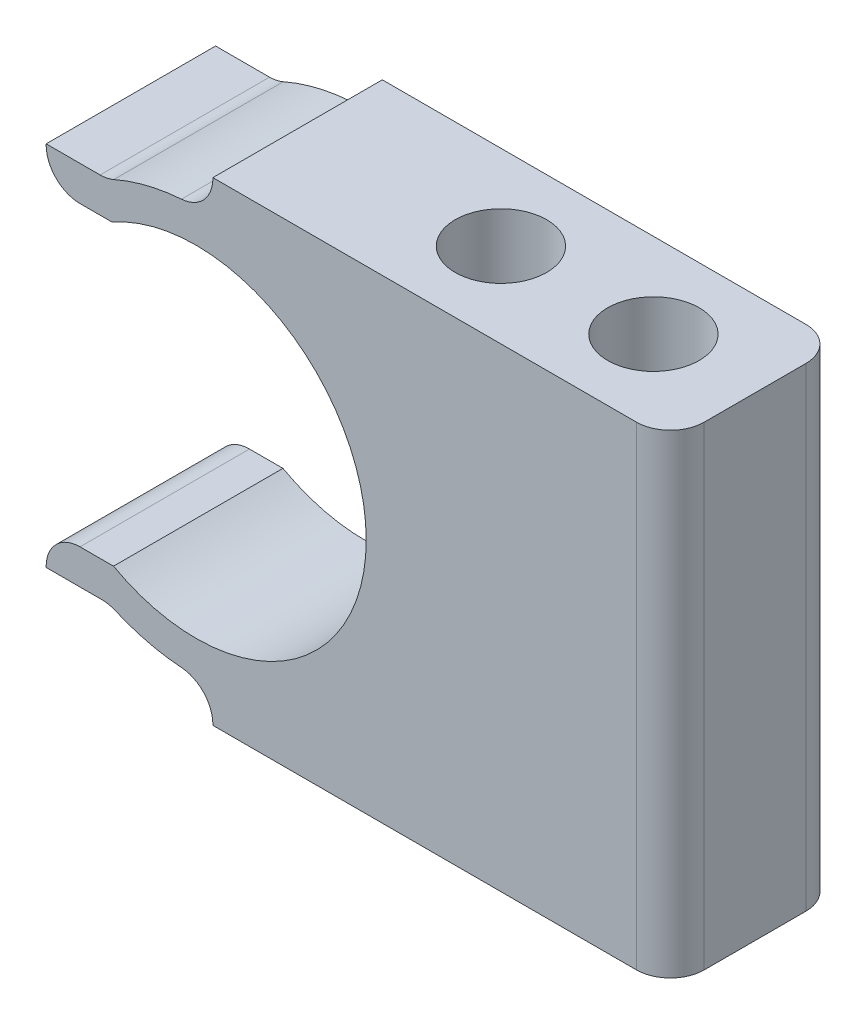
ISO-10303-21;
HEADER;
FILE_DESCRIPTION(('STEP AP214'),'2;1');
FILE_NAME('part.step','',(''),(''),'','','');
FILE_SCHEMA(('AUTOMOTIVE_DESIGN { 1 0 10303 214 1 1 1 1 }'));
ENDSEC;
DATA;
#1=APPLICATION_CONTEXT('core data for automotive mechanical design processes');
#2=APPLICATION_PROTOCOL_DEFINITION('international standard','automotive_design',2000,#1);
#3=PRODUCT_CONTEXT('',#1,'mechanical');
#4=PRODUCT('Part','Part','',(#3));
#5=PRODUCT_RELATED_PRODUCT_CATEGORY('part','',(#4));
#6=PRODUCT_DEFINITION_FORMATION('','',#4);
#7=PRODUCT_DEFINITION_CONTEXT('part definition',#1,'design');
#8=PRODUCT_DEFINITION('design','',#6,#7);
#9=PRODUCT_DEFINITION_SHAPE('','',#8);
#10=(LENGTH_UNIT() NAMED_UNIT(*) SI_UNIT(.MILLI.,.METRE.));
#11=(NAMED_UNIT(*) PLANE_ANGLE_UNIT() SI_UNIT($,.RADIAN.));
#12=(NAMED_UNIT(*) SI_UNIT($,.STERADIAN.) SOLID_ANGLE_UNIT());
#13=UNCERTAINTY_MEASURE_WITH_UNIT(LENGTH_MEASURE(1.E-05),#10,'distance_accuracy_value','');
#14=(GEOMETRIC_REPRESENTATION_CONTEXT(3) GLOBAL_UNCERTAINTY_ASSIGNED_CONTEXT((#13)) GLOBAL_UNIT_ASSIGNED_CONTEXT((#10,
#11,#12)) REPRESENTATION_CONTEXT('',''));
#15=CARTESIAN_POINT('',(0.,0.,0.));
#16=DIRECTION('',(0.,0.,1.));
#17=DIRECTION('',(1.,0.,0.));
#18=AXIS2_PLACEMENT_3D('',#15,#16,#17);
#19=CARTESIAN_POINT('',(0.,0.,10.));
#20=DIRECTION('',(0.,0.,-1.));
#21=DIRECTION('',(-1.,0.,0.));
#22=AXIS2_PLACEMENT_3D('',#19,#20,#21);
#23=CYLINDRICAL_SURFACE('',#22,10.05);
#24=CARTESIAN_POINT('',(0.,0.,0.));
#25=DIRECTION('',(0.,0.,-1.));
#26=DIRECTION('',(1.,0.,0.));
#27=AXIS2_PLACEMENT_3D('',#24,#25,#26);
#28=CIRCLE('',#27,10.05);
#29=CARTESIAN_POINT('',(-4.94368283772331,8.75,0.));
#30=VERTEX_POINT('',#29);
#31=CARTESIAN_POINT('',(-4.86543532867307,-8.79375,0.));
#32=VERTEX_POINT('',#31);
#33=EDGE_CURVE('E208',#30,#32,#28,.T.);
#34=ORIENTED_EDGE('',*,*,#33,.T.);
#35=DIRECTION('',(0.,0.,-1.));
#36=VECTOR('',#35,1.);
#37=CARTESIAN_POINT('',(-4.86543532867307,-8.79375,10.));
#38=LINE('',#37,#36);
#39=CARTESIAN_POINT('',(-4.86543532867307,-8.79375,10.));
#40=VERTEX_POINT('',#39);
#41=EDGE_CURVE('E188',#40,#32,#38,.T.);
#42=ORIENTED_EDGE('',*,*,#41,.F.);
#43=CARTESIAN_POINT('',(0.,0.,10.));
#44=DIRECTION('',(0.,0.,-1.));
#45=DIRECTION('',(1.,0.,0.));
#46=AXIS2_PLACEMENT_3D('',#43,#44,#45);
#47=CIRCLE('',#46,10.05);
#48=CARTESIAN_POINT('',(-4.94368283772331,8.75,10.));
#49=VERTEX_POINT('',#48);
#50=EDGE_CURVE('E195',#49,#40,#47,.T.);
#51=ORIENTED_EDGE('',*,*,#50,.F.);
#52=DIRECTION('',(0.,0.,-1.));
#53=VECTOR('',#52,1.);
#54=CARTESIAN_POINT('',(-4.94368283772331,8.75,10.));
#55=LINE('',#54,#53);
#56=EDGE_CURVE('E318',#49,#30,#55,.T.);
#57=ORIENTED_EDGE('',*,*,#56,.T.);
#58=EDGE_LOOP('',(#34,#42,#51,#57));
#59=FACE_BOUND('',#58,.T.);
#60=ADVANCED_FACE('F33',(#59),#23,.F.);
#61=CARTESIAN_POINT('',(-8.84122918275927,-8.79375,10.));
#62=DIRECTION('',(0.,-1.,0.));
#63=DIRECTION('',(0.,0.,-1.));
#64=AXIS2_PLACEMENT_3D('',#61,#62,#63);
#65=PLANE('',#64);
#66=DIRECTION('',(-1.,0.,0.));
#67=VECTOR('',#66,1.);
#68=CARTESIAN_POINT('',(-8.84122918275927,-8.79375,0.));
#69=LINE('',#68,#67);
#70=CARTESIAN_POINT('',(-6.84122918275927,-8.79375,0.));
#71=VERTEX_POINT('',#70);
#72=EDGE_CURVE('E320',#32,#71,#69,.T.);
#73=ORIENTED_EDGE('',*,*,#72,.T.);
#74=DIRECTION('',(0.,0.,-1.));
#75=VECTOR('',#74,1.);
#76=CARTESIAN_POINT('',(-6.84122918275927,-8.79375,10.));
#77=LINE('',#76,#75);
#78=CARTESIAN_POINT('',(-6.84122918275927,-8.79375,10.));
#79=VERTEX_POINT('',#78);
#80=EDGE_CURVE('E191',#71,#79,#77,.F.);
#81=ORIENTED_EDGE('',*,*,#80,.T.);
#82=DIRECTION('',(-1.,0.,0.));
#83=VECTOR('',#82,1.);
#84=CARTESIAN_POINT('',(-8.84122918275927,-8.79375,10.));
#85=LINE('',#84,#83);
#86=EDGE_CURVE('E183',#40,#79,#85,.T.);
#87=ORIENTED_EDGE('',*,*,#86,.F.);
#88=ORIENTED_EDGE('',*,*,#41,.T.);
#89=EDGE_LOOP('',(#73,#81,#87,#88));
#90=FACE_BOUND('',#89,.T.);
#91=ADVANCED_FACE('F186',(#90),#65,.F.);
#92=CARTESIAN_POINT('',(-8.84122918275927,-8.79375,10.));
#93=DIRECTION('',(1.,0.,0.));
#94=DIRECTION('',(0.,0.,-1.));
#95=AXIS2_PLACEMENT_3D('',#92,#93,#94);
#96=PLANE('',#95);
#97=DIRECTION('',(0.,-1.,0.));
#98=VECTOR('',#97,1.);
#99=CARTESIAN_POINT('',(-8.84122918275927,-8.79375,10.));
#100=LINE('',#99,#98);
#101=CARTESIAN_POINT('',(-8.84122918275927,-10.79375,10.));
#102=VERTEX_POINT('',#101);
#103=CARTESIAN_POINT('',(-8.84122918275927,-10.8492411194625,10.));
#104=VERTEX_POINT('',#103);
#105=EDGE_CURVE('E194',#102,#104,#100,.T.);
#106=ORIENTED_EDGE('',*,*,#105,.F.);
#107=DIRECTION('',(0.,0.,-1.));
#108=VECTOR('',#107,1.);
#109=CARTESIAN_POINT('',(-8.84122918275927,-10.79375,10.));
#110=LINE('',#109,#108);
#111=CARTESIAN_POINT('',(-8.84122918275927,-10.79375,0.));
#112=VERTEX_POINT('',#111);
#113=EDGE_CURVE('E251',#102,#112,#110,.T.);
#114=ORIENTED_EDGE('',*,*,#113,.T.);
#115=DIRECTION('',(0.,-1.,0.));
#116=VECTOR('',#115,1.);
#117=CARTESIAN_POINT('',(-8.84122918275927,-8.79375,0.));
#118=LINE('',#117,#116);
#119=CARTESIAN_POINT('',(-8.84122918275927,-10.8492411194625,0.));
#120=VERTEX_POINT('',#119);
#121=EDGE_CURVE('E323',#112,#120,#118,.T.);
#122=ORIENTED_EDGE('',*,*,#121,.T.);
#123=DIRECTION('',(0.,0.,-1.));
#124=VECTOR('',#123,1.);
#125=CARTESIAN_POINT('',(-8.84122918275927,-10.8492411194625,10.));
#126=LINE('',#125,#124);
#127=EDGE_CURVE('E210',#104,#120,#126,.T.);
#128=ORIENTED_EDGE('',*,*,#127,.F.);
#129=EDGE_LOOP('',(#106,#114,#122,#128));
#130=FACE_BOUND('',#129,.T.);
#131=ADVANCED_FACE('F408',(#130),#96,.F.);
#132=CARTESIAN_POINT('',(-5.12776434050588,-10.8492411194625,10.));
#133=DIRECTION('',(0.,1.,0.));
#134=DIRECTION('',(-1.,0.,0.));
#135=AXIS2_PLACEMENT_3D('',#132,#133,#134);
#136=PLANE('',#135);
#137=DIRECTION('',(1.,0.,0.));
#138=VECTOR('',#137,1.);
#139=CARTESIAN_POINT('',(-5.12776434050588,-10.8492411194625,0.));
#140=LINE('',#139,#138);
#141=CARTESIAN_POINT('',(-5.55850723251429,-10.8492411194625,0.));
#142=VERTEX_POINT('',#141);
#143=EDGE_CURVE('E325',#120,#142,#140,.T.);
#144=ORIENTED_EDGE('',*,*,#143,.T.);
#145=DIRECTION('',(0.,0.,1.));
#146=VECTOR('',#145,1.);
#147=CARTESIAN_POINT('',(-5.55850723251429,-10.8492411194625,10.));
#148=LINE('',#147,#146);
#149=CARTESIAN_POINT('',(-5.55850723251429,-10.8492411194625,10.));
#150=VERTEX_POINT('',#149);
#151=EDGE_CURVE('E231',#142,#150,#148,.T.);
#152=ORIENTED_EDGE('',*,*,#151,.T.);
#153=DIRECTION('',(1.,0.,0.));
#154=VECTOR('',#153,1.);
#155=CARTESIAN_POINT('',(-5.12776434050588,-10.8492411194625,10.));
#156=LINE('',#155,#154);
#157=EDGE_CURVE('E634',#104,#150,#156,.T.);
#158=ORIENTED_EDGE('',*,*,#157,.F.);
#159=ORIENTED_EDGE('',*,*,#127,.T.);
#160=EDGE_LOOP('',(#144,#152,#158,#159));
#161=FACE_BOUND('',#160,.T.);
#162=ADVANCED_FACE('F596',(#161),#136,.F.);
#163=CARTESIAN_POINT('',(0.,0.,10.));
#164=DIRECTION('',(0.,0.,-1.));
#165=DIRECTION('',(-1.,0.,0.));
#166=AXIS2_PLACEMENT_3D('',#163,#164,#165);
#167=CYLINDRICAL_SURFACE('',#166,12.);
#168=CARTESIAN_POINT('',(0.,0.,0.));
#169=DIRECTION('',(0.,0.,1.));
#170=DIRECTION('',(1.,0.,0.));
#171=AXIS2_PLACEMENT_3D('',#168,#169,#170);
#172=CIRCLE('',#171,12.);
#173=CARTESIAN_POINT('',(-4.76443477072653,-11.0136352452536,0.));
#174=VERTEX_POINT('',#173);
#175=CARTESIAN_POINT('',(-0.857142857142852,-11.9693486089448,0.));
#176=VERTEX_POINT('',#175);
#177=EDGE_CURVE('E328',#174,#176,#172,.T.);
#178=ORIENTED_EDGE('',*,*,#177,.T.);
#179=DIRECTION('',(0.,0.,-1.));
#180=VECTOR('',#179,1.);
#181=CARTESIAN_POINT('',(-0.857142857142852,-11.9693486089448,10.));
#182=LINE('',#181,#180);
#183=CARTESIAN_POINT('',(-0.857142857142852,-11.9693486089448,10.));
#184=VERTEX_POINT('',#183);
#185=EDGE_CURVE('E222',#176,#184,#182,.F.);
#186=ORIENTED_EDGE('',*,*,#185,.T.);
#187=CARTESIAN_POINT('',(0.,0.,10.));
#188=DIRECTION('',(0.,0.,1.));
#189=DIRECTION('',(1.,0.,0.));
#190=AXIS2_PLACEMENT_3D('',#187,#188,#189);
#191=CIRCLE('',#190,12.);
#192=CARTESIAN_POINT('',(-4.76443477072653,-11.0136352452536,10.));
#193=VERTEX_POINT('',#192);
#194=EDGE_CURVE('E384',#193,#184,#191,.T.);
#195=ORIENTED_EDGE('',*,*,#194,.F.);
#196=DIRECTION('',(0.,0.,-1.));
#197=VECTOR('',#196,1.);
#198=CARTESIAN_POINT('',(-4.76443477072653,-11.0136352452536,10.));
#199=LINE('',#198,#197);
#200=EDGE_CURVE('E213',#193,#174,#199,.T.);
#201=ORIENTED_EDGE('',*,*,#200,.T.);
#202=EDGE_LOOP('',(#178,#186,#195,#201));
#203=FACE_BOUND('',#202,.T.);
#204=ADVANCED_FACE('F587',(#203),#167,.T.);
#205=CARTESIAN_POINT('',(1.00000000000001,-11.9582607431014,10.));
#206=DIRECTION('',(1.,0.,0.));
#207=DIRECTION('',(0.,1.,0.));
#208=AXIS2_PLACEMENT_3D('',#205,#206,#207);
#209=PLANE('',#208);
#210=DIRECTION('',(0.,-1.,0.));
#211=VECTOR('',#210,1.);
#212=CARTESIAN_POINT('',(1.00000000000001,-11.9582607431014,10.));
#213=LINE('',#212,#211);
#214=CARTESIAN_POINT('',(1.00000000000001,-13.9642400437689,10.));
#215=VERTEX_POINT('',#214);
#216=CARTESIAN_POINT('',(1.00000000000001,-14.,10.));
#217=VERTEX_POINT('',#216);
#218=EDGE_CURVE('E363',#215,#217,#213,.T.);
#219=ORIENTED_EDGE('',*,*,#218,.F.);
#220=DIRECTION('',(0.,0.,1.));
#221=VECTOR('',#220,1.);
#222=CARTESIAN_POINT('',(1.00000000000001,-13.9642400437689,0.));
#223=LINE('',#222,#221);
#224=CARTESIAN_POINT('',(1.00000000000001,-13.9642400437689,0.));
#225=VERTEX_POINT('',#224);
#226=EDGE_CURVE('E209',#215,#225,#223,.F.);
#227=ORIENTED_EDGE('',*,*,#226,.T.);
#228=DIRECTION('',(0.,-1.,0.));
#229=VECTOR('',#228,1.);
#230=CARTESIAN_POINT('',(1.00000000000001,-11.9582607431014,0.));
#231=LINE('',#230,#229);
#232=CARTESIAN_POINT('',(1.00000000000001,-14.,0.));
#233=VERTEX_POINT('',#232);
#234=EDGE_CURVE('E331',#225,#233,#231,.T.);
#235=ORIENTED_EDGE('',*,*,#234,.T.);
#236=DIRECTION('',(0.,0.,-1.));
#237=VECTOR('',#236,1.);
#238=CARTESIAN_POINT('',(1.00000000000001,-14.,10.));
#239=LINE('',#238,#237);
#240=EDGE_CURVE('E216',#217,#233,#239,.T.);
#241=ORIENTED_EDGE('',*,*,#240,.F.);
#242=EDGE_LOOP('',(#219,#227,#235,#241));
#243=FACE_BOUND('',#242,.T.);
#244=ADVANCED_FACE('F362',(#243),#209,.F.);
#245=CARTESIAN_POINT('',(10.,-14.,10.));
#246=DIRECTION('',(0.,1.,0.));
#247=DIRECTION('',(0.,0.,1.));
#248=AXIS2_PLACEMENT_3D('',#245,#246,#247);
#249=PLANE('',#248);
#250=CARTESIAN_POINT('',(22.,-14.,5.));
#251=DIRECTION('',(0.,-1.,0.));
#252=DIRECTION('',(0.,0.,-1.));
#253=AXIS2_PLACEMENT_3D('',#250,#251,#252);
#254=CIRCLE('',#253,2.7);
#255=CARTESIAN_POINT('',(22.,-14.,2.3));
#256=VERTEX_POINT('',#255);
#257=EDGE_CURVE('E648',#256,#256,#254,.T.);
#258=ORIENTED_EDGE('',*,*,#257,.F.);
#259=EDGE_LOOP('',(#258));
#260=FACE_BOUND('',#259,.T.);
#261=CARTESIAN_POINT('',(13.,-14.,5.));
#262=DIRECTION('',(0.,-1.,0.));
#263=DIRECTION('',(0.,0.,-1.));
#264=AXIS2_PLACEMENT_3D('',#261,#262,#263);
#265=CIRCLE('',#264,2.7);
#266=CARTESIAN_POINT('',(13.,-14.,2.3));
#267=VERTEX_POINT('',#266);
#268=EDGE_CURVE('E642',#267,#267,#265,.T.);
#269=ORIENTED_EDGE('',*,*,#268,.F.);
#270=EDGE_LOOP('',(#269));
#271=FACE_BOUND('',#270,.T.);
#272=DIRECTION('',(1.,0.,0.));
#273=VECTOR('',#272,1.);
#274=CARTESIAN_POINT('',(10.,-14.,0.));
#275=LINE('',#274,#273);
#276=CARTESIAN_POINT('',(26.,-14.,0.));
#277=VERTEX_POINT('',#276);
#278=EDGE_CURVE('E333',#233,#277,#275,.T.);
#279=ORIENTED_EDGE('',*,*,#278,.T.);
#280=CARTESIAN_POINT('',(26.,-14.,2.));
#281=DIRECTION('',(0.,1.,0.));
#282=DIRECTION('',(0.,0.,1.));
#283=AXIS2_PLACEMENT_3D('',#280,#281,#282);
#284=CIRCLE('',#283,2.);
#285=CARTESIAN_POINT('',(28.,-14.,2.));
#286=VERTEX_POINT('',#285);
#287=EDGE_CURVE('E48',#277,#286,#284,.F.);
#288=ORIENTED_EDGE('',*,*,#287,.T.);
#289=DIRECTION('',(0.,0.,-1.));
#290=VECTOR('',#289,1.);
#291=CARTESIAN_POINT('',(28.,-14.,10.));
#292=LINE('',#291,#290);
#293=CARTESIAN_POINT('',(28.,-14.,8.));
#294=VERTEX_POINT('',#293);
#295=EDGE_CURVE('E352',#294,#286,#292,.T.);
#296=ORIENTED_EDGE('',*,*,#295,.F.);
#297=CARTESIAN_POINT('',(26.,-14.,8.));
#298=DIRECTION('',(0.,1.,0.));
#299=DIRECTION('',(0.,0.,1.));
#300=AXIS2_PLACEMENT_3D('',#297,#298,#299);
#301=CIRCLE('',#300,2.);
#302=CARTESIAN_POINT('',(26.,-14.,10.));
#303=VERTEX_POINT('',#302);
#304=EDGE_CURVE('E266',#294,#303,#301,.F.);
#305=ORIENTED_EDGE('',*,*,#304,.T.);
#306=DIRECTION('',(1.,0.,0.));
#307=VECTOR('',#306,1.);
#308=CARTESIAN_POINT('',(10.,-14.,10.));
#309=LINE('',#308,#307);
#310=EDGE_CURVE('E359',#217,#303,#309,.T.);
#311=ORIENTED_EDGE('',*,*,#310,.F.);
#312=ORIENTED_EDGE('',*,*,#240,.T.);
#313=EDGE_LOOP('',(#279,#288,#296,#305,#311,#312));
#314=FACE_BOUND('',#313,.T.);
#315=ADVANCED_FACE('F356',(#260,#271,#314),#249,.F.);
#316=CARTESIAN_POINT('',(28.,14.,10.));
#317=DIRECTION('',(-1.,0.,0.));
#318=DIRECTION('',(0.,0.,1.));
#319=AXIS2_PLACEMENT_3D('',#316,#317,#318);
#320=PLANE('',#319);
#321=ORIENTED_EDGE('',*,*,#295,.T.);
#322=DIRECTION('',(0.,1.,0.));
#323=VECTOR('',#322,1.);
#324=CARTESIAN_POINT('',(28.,14.,2.));
#325=LINE('',#324,#323);
#326=CARTESIAN_POINT('',(28.,14.,2.));
#327=VERTEX_POINT('',#326);
#328=EDGE_CURVE('E259',#286,#327,#325,.T.);
#329=ORIENTED_EDGE('',*,*,#328,.T.);
#330=DIRECTION('',(0.,0.,-1.));
#331=VECTOR('',#330,1.);
#332=CARTESIAN_POINT('',(28.,14.,10.));
#333=LINE('',#332,#331);
#334=CARTESIAN_POINT('',(28.,14.,8.));
#335=VERTEX_POINT('',#334);
#336=EDGE_CURVE('E349',#335,#327,#333,.T.);
#337=ORIENTED_EDGE('',*,*,#336,.F.);
#338=DIRECTION('',(0.,1.,0.));
#339=VECTOR('',#338,1.);
#340=CARTESIAN_POINT('',(28.,-14.,8.));
#341=LINE('',#340,#339);
#342=EDGE_CURVE('E55',#335,#294,#341,.F.);
#343=ORIENTED_EDGE('',*,*,#342,.T.);
#344=EDGE_LOOP('',(#321,#329,#337,#343));
#345=FACE_BOUND('',#344,.T.);
#346=ADVANCED_FACE('F372',(#345),#320,.F.);
#347=CARTESIAN_POINT('',(5.99999999999999,14.,10.));
#348=DIRECTION('',(0.,-1.,0.));
#349=DIRECTION('',(0.,0.,-1.));
#350=AXIS2_PLACEMENT_3D('',#347,#348,#349);
#351=PLANE('',#350);
#352=CARTESIAN_POINT('',(22.,14.,5.));
#353=DIRECTION('',(0.,-1.,0.));
#354=DIRECTION('',(0.,0.,-1.));
#355=AXIS2_PLACEMENT_3D('',#352,#353,#354);
#356=CIRCLE('',#355,2.7);
#357=CARTESIAN_POINT('',(22.,14.,2.3));
#358=VERTEX_POINT('',#357);
#359=EDGE_CURVE('E645',#358,#358,#356,.T.);
#360=ORIENTED_EDGE('',*,*,#359,.T.);
#361=EDGE_LOOP('',(#360));
#362=FACE_BOUND('',#361,.T.);
#363=CARTESIAN_POINT('',(13.,14.,5.));
#364=DIRECTION('',(0.,-1.,0.));
#365=DIRECTION('',(0.,0.,-1.));
#366=AXIS2_PLACEMENT_3D('',#363,#364,#365);
#367=CIRCLE('',#366,2.7);
#368=CARTESIAN_POINT('',(13.,14.,2.3));
#369=VERTEX_POINT('',#368);
#370=EDGE_CURVE('E321',#369,#369,#367,.T.);
#371=ORIENTED_EDGE('',*,*,#370,.T.);
#372=EDGE_LOOP('',(#371));
#373=FACE_BOUND('',#372,.T.);
#374=ORIENTED_EDGE('',*,*,#336,.T.);
#375=CARTESIAN_POINT('',(26.,14.,2.));
#376=DIRECTION('',(0.,-1.,0.));
#377=DIRECTION('',(0.,0.,-1.));
#378=AXIS2_PLACEMENT_3D('',#375,#376,#377);
#379=CIRCLE('',#378,2.);
#380=CARTESIAN_POINT('',(26.,14.,0.));
#381=VERTEX_POINT('',#380);
#382=EDGE_CURVE('E264',#327,#381,#379,.F.);
#383=ORIENTED_EDGE('',*,*,#382,.T.);
#384=DIRECTION('',(-1.,0.,0.));
#385=VECTOR('',#384,1.);
#386=CARTESIAN_POINT('',(5.99999999999999,14.,0.));
#387=LINE('',#386,#385);
#388=CARTESIAN_POINT('',(1.00000000000001,14.,0.));
#389=VERTEX_POINT('',#388);
#390=EDGE_CURVE('E335',#381,#389,#387,.T.);
#391=ORIENTED_EDGE('',*,*,#390,.T.);
#392=DIRECTION('',(0.,0.,-1.));
#393=VECTOR('',#392,1.);
#394=CARTESIAN_POINT('',(1.00000000000001,14.,10.));
#395=LINE('',#394,#393);
#396=CARTESIAN_POINT('',(1.00000000000001,14.,10.));
#397=VERTEX_POINT('',#396);
#398=EDGE_CURVE('E346',#397,#389,#395,.T.);
#399=ORIENTED_EDGE('',*,*,#398,.F.);
#400=DIRECTION('',(-1.,0.,0.));
#401=VECTOR('',#400,1.);
#402=CARTESIAN_POINT('',(5.99999999999999,14.,10.));
#403=LINE('',#402,#401);
#404=CARTESIAN_POINT('',(26.,14.,10.));
#405=VERTEX_POINT('',#404);
#406=EDGE_CURVE('E377',#405,#397,#403,.T.);
#407=ORIENTED_EDGE('',*,*,#406,.F.);
#408=CARTESIAN_POINT('',(26.,14.,8.));
#409=DIRECTION('',(0.,-1.,0.));
#410=DIRECTION('',(0.,0.,-1.));
#411=AXIS2_PLACEMENT_3D('',#408,#409,#410);
#412=CIRCLE('',#411,2.);
#413=EDGE_CURVE('E262',#405,#335,#412,.F.);
#414=ORIENTED_EDGE('',*,*,#413,.T.);
#415=EDGE_LOOP('',(#374,#383,#391,#399,#407,#414));
#416=FACE_BOUND('',#415,.T.);
#417=ADVANCED_FACE('F374',(#362,#373,#416),#351,.F.);
#418=CARTESIAN_POINT('',(1.00000000000001,14.,10.));
#419=DIRECTION('',(1.,0.,0.));
#420=DIRECTION('',(0.,1.,0.));
#421=AXIS2_PLACEMENT_3D('',#418,#419,#420);
#422=PLANE('',#421);
#423=DIRECTION('',(0.,-1.,0.));
#424=VECTOR('',#423,1.);
#425=CARTESIAN_POINT('',(1.00000000000001,14.,0.));
#426=LINE('',#425,#424);
#427=CARTESIAN_POINT('',(1.00000000000001,13.9642400437689,0.));
#428=VERTEX_POINT('',#427);
#429=EDGE_CURVE('E297',#389,#428,#426,.T.);
#430=ORIENTED_EDGE('',*,*,#429,.T.);
#431=DIRECTION('',(0.,0.,1.));
#432=VECTOR('',#431,1.);
#433=CARTESIAN_POINT('',(1.00000000000001,13.9642400437689,10.));
#434=LINE('',#433,#432);
#435=CARTESIAN_POINT('',(1.00000000000001,13.9642400437689,10.));
#436=VERTEX_POINT('',#435);
#437=EDGE_CURVE('E229',#428,#436,#434,.T.);
#438=ORIENTED_EDGE('',*,*,#437,.T.);
#439=DIRECTION('',(0.,-1.,0.));
#440=VECTOR('',#439,1.);
#441=CARTESIAN_POINT('',(1.00000000000001,14.,10.));
#442=LINE('',#441,#440);
#443=EDGE_CURVE('E313',#397,#436,#442,.T.);
#444=ORIENTED_EDGE('',*,*,#443,.F.);
#445=ORIENTED_EDGE('',*,*,#398,.T.);
#446=EDGE_LOOP('',(#430,#438,#444,#445));
#447=FACE_BOUND('',#446,.T.);
#448=ADVANCED_FACE('F393',(#447),#422,.F.);
#449=CARTESIAN_POINT('',(0.,0.,10.));
#450=DIRECTION('',(0.,0.,-1.));
#451=DIRECTION('',(-1.,0.,0.));
#452=AXIS2_PLACEMENT_3D('',#449,#450,#451);
#453=CYLINDRICAL_SURFACE('',#452,12.);
#454=CARTESIAN_POINT('',(0.,0.,10.));
#455=DIRECTION('',(0.,0.,1.));
#456=DIRECTION('',(1.,0.,0.));
#457=AXIS2_PLACEMENT_3D('',#454,#455,#456);
#458=CIRCLE('',#457,12.);
#459=CARTESIAN_POINT('',(-0.857142857142852,11.9693486089448,10.));
#460=VERTEX_POINT('',#459);
#461=CARTESIAN_POINT('',(-4.8483397905279,10.9769577422701,10.));
#462=VERTEX_POINT('',#461);
#463=EDGE_CURVE('E304',#460,#462,#458,.T.);
#464=ORIENTED_EDGE('',*,*,#463,.F.);
#465=DIRECTION('',(0.,0.,-1.));
#466=VECTOR('',#465,1.);
#467=CARTESIAN_POINT('',(-0.857142857142852,11.9693486089448,10.));
#468=LINE('',#467,#466);
#469=CARTESIAN_POINT('',(-0.857142857142852,11.9693486089448,0.));
#470=VERTEX_POINT('',#469);
#471=EDGE_CURVE('E226',#460,#470,#468,.T.);
#472=ORIENTED_EDGE('',*,*,#471,.T.);
#473=CARTESIAN_POINT('',(0.,0.,0.));
#474=DIRECTION('',(0.,0.,1.));
#475=DIRECTION('',(1.,0.,0.));
#476=AXIS2_PLACEMENT_3D('',#473,#474,#475);
#477=CIRCLE('',#476,12.);
#478=CARTESIAN_POINT('',(-4.8483397905279,10.9769577422701,0.));
#479=VERTEX_POINT('',#478);
#480=EDGE_CURVE('E286',#470,#479,#477,.T.);
#481=ORIENTED_EDGE('',*,*,#480,.T.);
#482=DIRECTION('',(0.,0.,-1.));
#483=VECTOR('',#482,1.);
#484=CARTESIAN_POINT('',(-4.8483397905279,10.9769577422701,10.));
#485=LINE('',#484,#483);
#486=EDGE_CURVE('E224',#479,#462,#485,.F.);
#487=ORIENTED_EDGE('',*,*,#486,.T.);
#488=EDGE_LOOP('',(#464,#472,#481,#487));
#489=FACE_BOUND('',#488,.T.);
#490=ADVANCED_FACE('F294',(#489),#453,.T.);
#491=CARTESIAN_POINT('',(-5.21733871655573,10.8064506993151,10.));
#492=DIRECTION('',(0.,-1.,0.));
#493=DIRECTION('',(0.,0.,-1.));
#494=AXIS2_PLACEMENT_3D('',#491,#492,#493);
#495=PLANE('',#494);
#496=DIRECTION('',(-1.,0.,0.));
#497=VECTOR('',#496,1.);
#498=CARTESIAN_POINT('',(-5.21733871655573,10.8064506993151,10.));
#499=LINE('',#498,#497);
#500=CARTESIAN_POINT('',(-5.65639642228255,10.8064506993151,10.));
#501=VERTEX_POINT('',#500);
#502=CARTESIAN_POINT('',(-8.84122918275927,10.8064506993151,10.));
#503=VERTEX_POINT('',#502);
#504=EDGE_CURVE('E302',#501,#503,#499,.T.);
#505=ORIENTED_EDGE('',*,*,#504,.F.);
#506=DIRECTION('',(0.,0.,1.));
#507=VECTOR('',#506,1.);
#508=CARTESIAN_POINT('',(-5.65639642228255,10.8064506993151,0.));
#509=LINE('',#508,#507);
#510=CARTESIAN_POINT('',(-5.65639642228255,10.8064506993151,0.));
#511=VERTEX_POINT('',#510);
#512=EDGE_CURVE('E255',#501,#511,#509,.F.);
#513=ORIENTED_EDGE('',*,*,#512,.T.);
#514=DIRECTION('',(-1.,0.,0.));
#515=VECTOR('',#514,1.);
#516=CARTESIAN_POINT('',(-5.21733871655573,10.8064506993151,0.));
#517=LINE('',#516,#515);
#518=CARTESIAN_POINT('',(-8.84122918275927,10.8064506993151,0.));
#519=VERTEX_POINT('',#518);
#520=EDGE_CURVE('E288',#511,#519,#517,.T.);
#521=ORIENTED_EDGE('',*,*,#520,.T.);
#522=DIRECTION('',(0.,0.,-1.));
#523=VECTOR('',#522,1.);
#524=CARTESIAN_POINT('',(-8.84122918275927,10.8064506993151,10.));
#525=LINE('',#524,#523);
#526=EDGE_CURVE('E308',#503,#519,#525,.T.);
#527=ORIENTED_EDGE('',*,*,#526,.F.);
#528=EDGE_LOOP('',(#505,#513,#521,#527));
#529=FACE_BOUND('',#528,.T.);
#530=ADVANCED_FACE('F306',(#529),#495,.F.);
#531=CARTESIAN_POINT('',(-8.84122918275927,8.75,10.));
#532=DIRECTION('',(1.,0.,0.));
#533=DIRECTION('',(0.,1.,0.));
#534=AXIS2_PLACEMENT_3D('',#531,#532,#533);
#535=PLANE('',#534);
#536=DIRECTION('',(0.,-1.,0.));
#537=VECTOR('',#536,1.);
#538=CARTESIAN_POINT('',(-8.84122918275927,8.75,0.));
#539=LINE('',#538,#537);
#540=CARTESIAN_POINT('',(-8.84122918275927,10.75,0.));
#541=VERTEX_POINT('',#540);
#542=EDGE_CURVE('E340',#519,#541,#539,.T.);
#543=ORIENTED_EDGE('',*,*,#542,.T.);
#544=DIRECTION('',(0.,0.,-1.));
#545=VECTOR('',#544,1.);
#546=CARTESIAN_POINT('',(-8.84122918275927,10.75,10.));
#547=LINE('',#546,#545);
#548=CARTESIAN_POINT('',(-8.84122918275927,10.75,10.));
#549=VERTEX_POINT('',#548);
#550=EDGE_CURVE('E242',#541,#549,#547,.F.);
#551=ORIENTED_EDGE('',*,*,#550,.T.);
#552=DIRECTION('',(0.,-1.,0.));
#553=VECTOR('',#552,1.);
#554=CARTESIAN_POINT('',(-8.84122918275927,8.75,10.));
#555=LINE('',#554,#553);
#556=EDGE_CURVE('E310',#503,#549,#555,.T.);
#557=ORIENTED_EDGE('',*,*,#556,.F.);
#558=ORIENTED_EDGE('',*,*,#526,.T.);
#559=EDGE_LOOP('',(#543,#551,#557,#558));
#560=FACE_BOUND('',#559,.T.);
#561=ADVANCED_FACE('F457',(#560),#535,.F.);
#562=CARTESIAN_POINT('',(-8.84122918275927,8.75,10.));
#563=DIRECTION('',(0.,1.,0.));
#564=DIRECTION('',(0.,0.,1.));
#565=AXIS2_PLACEMENT_3D('',#562,#563,#564);
#566=PLANE('',#565);
#567=DIRECTION('',(1.,0.,0.));
#568=VECTOR('',#567,1.);
#569=CARTESIAN_POINT('',(-8.84122918275927,8.75,10.));
#570=LINE('',#569,#568);
#571=CARTESIAN_POINT('',(-6.84122918275927,8.75,10.));
#572=VERTEX_POINT('',#571);
#573=EDGE_CURVE('E201',#572,#49,#570,.T.);
#574=ORIENTED_EDGE('',*,*,#573,.F.);
#575=DIRECTION('',(0.,0.,-1.));
#576=VECTOR('',#575,1.);
#577=CARTESIAN_POINT('',(-6.84122918275927,8.75,10.));
#578=LINE('',#577,#576);
#579=CARTESIAN_POINT('',(-6.84122918275927,8.75,0.));
#580=VERTEX_POINT('',#579);
#581=EDGE_CURVE('E233',#572,#580,#578,.T.);
#582=ORIENTED_EDGE('',*,*,#581,.T.);
#583=DIRECTION('',(1.,0.,0.));
#584=VECTOR('',#583,1.);
#585=CARTESIAN_POINT('',(-8.84122918275927,8.75,0.));
#586=LINE('',#585,#584);
#587=EDGE_CURVE('E205',#580,#30,#586,.T.);
#588=ORIENTED_EDGE('',*,*,#587,.T.);
#589=ORIENTED_EDGE('',*,*,#56,.F.);
#590=EDGE_LOOP('',(#574,#582,#588,#589));
#591=FACE_BOUND('',#590,.T.);
#592=ADVANCED_FACE('F452',(#591),#566,.F.);
#593=CARTESIAN_POINT('',(0.,0.,10.));
#594=DIRECTION('',(0.,0.,1.));
#595=DIRECTION('',(1.,0.,0.));
#596=AXIS2_PLACEMENT_3D('',#593,#594,#595);
#597=PLANE('',#596);
#598=ORIENTED_EDGE('',*,*,#556,.T.);
#599=CARTESIAN_POINT('',(-6.84122918275927,10.75,10.));
#600=DIRECTION('',(0.,0.,1.));
#601=DIRECTION('',(1.,0.,0.));
#602=AXIS2_PLACEMENT_3D('',#599,#600,#601);
#603=CIRCLE('',#602,2.);
#604=EDGE_CURVE('E249',#549,#572,#603,.T.);
#605=ORIENTED_EDGE('',*,*,#604,.T.);
#606=ORIENTED_EDGE('',*,*,#573,.T.);
#607=ORIENTED_EDGE('',*,*,#50,.T.);
#608=ORIENTED_EDGE('',*,*,#86,.T.);
#609=CARTESIAN_POINT('',(-6.84122918275927,-10.79375,10.));
#610=DIRECTION('',(0.,0.,1.));
#611=DIRECTION('',(1.,0.,0.));
#612=AXIS2_PLACEMENT_3D('',#609,#610,#611);
#613=CIRCLE('',#612,2.);
#614=EDGE_CURVE('E247',#79,#102,#613,.T.);
#615=ORIENTED_EDGE('',*,*,#614,.T.);
#616=ORIENTED_EDGE('',*,*,#105,.T.);
#617=ORIENTED_EDGE('',*,*,#157,.T.);
#618=CARTESIAN_POINT('',(-5.55850723251428,-12.8492411194625,10.));
#619=DIRECTION('',(0.,0.,1.));
#620=DIRECTION('',(1.,0.,0.));
#621=AXIS2_PLACEMENT_3D('',#618,#619,#620);
#622=CIRCLE('',#621,2.);
#623=EDGE_CURVE('E279',#150,#193,#622,.F.);
#624=ORIENTED_EDGE('',*,*,#623,.T.);
#625=ORIENTED_EDGE('',*,*,#194,.T.);
#626=CARTESIAN_POINT('',(-0.999999999999994,-13.9642400437689,10.));
#627=DIRECTION('',(0.,0.,1.));
#628=DIRECTION('',(1.,0.,0.));
#629=AXIS2_PLACEMENT_3D('',#626,#627,#628);
#630=CIRCLE('',#629,2.);
#631=EDGE_CURVE('E271',#184,#215,#630,.F.);
#632=ORIENTED_EDGE('',*,*,#631,.T.);
#633=ORIENTED_EDGE('',*,*,#218,.T.);
#634=ORIENTED_EDGE('',*,*,#310,.T.);
#635=DIRECTION('',(0.,1.,0.));
#636=VECTOR('',#635,1.);
#637=CARTESIAN_POINT('',(26.,14.,10.));
#638=LINE('',#637,#636);
#639=EDGE_CURVE('E244',#303,#405,#638,.T.);
#640=ORIENTED_EDGE('',*,*,#639,.T.);
#641=ORIENTED_EDGE('',*,*,#406,.T.);
#642=ORIENTED_EDGE('',*,*,#443,.T.);
#643=CARTESIAN_POINT('',(-0.999999999999994,13.9642400437689,10.));
#644=DIRECTION('',(0.,0.,1.));
#645=DIRECTION('',(1.,0.,0.));
#646=AXIS2_PLACEMENT_3D('',#643,#644,#645);
#647=CIRCLE('',#646,2.);
#648=EDGE_CURVE('E275',#436,#460,#647,.F.);
#649=ORIENTED_EDGE('',*,*,#648,.T.);
#650=ORIENTED_EDGE('',*,*,#463,.T.);
#651=CARTESIAN_POINT('',(-5.65639642228255,12.8064506993151,10.));
#652=DIRECTION('',(0.,0.,1.));
#653=DIRECTION('',(1.,0.,0.));
#654=AXIS2_PLACEMENT_3D('',#651,#652,#653);
#655=CIRCLE('',#654,2.);
#656=EDGE_CURVE('E11',#462,#501,#655,.F.);
#657=ORIENTED_EDGE('',*,*,#656,.T.);
#658=ORIENTED_EDGE('',*,*,#504,.T.);
#659=EDGE_LOOP('',(#598,#605,#606,#607,#608,#615,#616,#617,#624,#625,#632,#633,#634,#640,#641,
#642,#649,#650,#657,#658));
#660=FACE_BOUND('',#659,.T.);
#661=ADVANCED_FACE('F199',(#660),#597,.T.);
#662=CARTESIAN_POINT('',(0.,0.,0.));
#663=DIRECTION('',(0.,0.,1.));
#664=DIRECTION('',(1.,0.,0.));
#665=AXIS2_PLACEMENT_3D('',#662,#663,#664);
#666=PLANE('',#665);
#667=ORIENTED_EDGE('',*,*,#587,.F.);
#668=CARTESIAN_POINT('',(-6.84122918275927,10.75,0.));
#669=DIRECTION('',(0.,0.,1.));
#670=DIRECTION('',(1.,0.,0.));
#671=AXIS2_PLACEMENT_3D('',#668,#669,#670);
#672=CIRCLE('',#671,2.);
#673=EDGE_CURVE('E240',#580,#541,#672,.F.);
#674=ORIENTED_EDGE('',*,*,#673,.T.);
#675=ORIENTED_EDGE('',*,*,#542,.F.);
#676=ORIENTED_EDGE('',*,*,#520,.F.);
#677=CARTESIAN_POINT('',(-5.65639642228255,12.8064506993151,0.));
#678=DIRECTION('',(0.,0.,1.));
#679=DIRECTION('',(1.,0.,0.));
#680=AXIS2_PLACEMENT_3D('',#677,#678,#679);
#681=CIRCLE('',#680,2.);
#682=EDGE_CURVE('E41',#511,#479,#681,.T.);
#683=ORIENTED_EDGE('',*,*,#682,.T.);
#684=ORIENTED_EDGE('',*,*,#480,.F.);
#685=CARTESIAN_POINT('',(-0.999999999999994,13.9642400437689,0.));
#686=DIRECTION('',(0.,0.,1.));
#687=DIRECTION('',(1.,0.,0.));
#688=AXIS2_PLACEMENT_3D('',#685,#686,#687);
#689=CIRCLE('',#688,2.);
#690=EDGE_CURVE('E273',#470,#428,#689,.T.);
#691=ORIENTED_EDGE('',*,*,#690,.T.);
#692=ORIENTED_EDGE('',*,*,#429,.F.);
#693=ORIENTED_EDGE('',*,*,#390,.F.);
#694=DIRECTION('',(0.,1.,0.));
#695=VECTOR('',#694,1.);
#696=CARTESIAN_POINT('',(26.,0.,0.));
#697=LINE('',#696,#695);
#698=EDGE_CURVE('E236',#381,#277,#697,.F.);
#699=ORIENTED_EDGE('',*,*,#698,.T.);
#700=ORIENTED_EDGE('',*,*,#278,.F.);
#701=ORIENTED_EDGE('',*,*,#234,.F.);
#702=CARTESIAN_POINT('',(-0.999999999999994,-13.9642400437689,0.));
#703=DIRECTION('',(0.,0.,1.));
#704=DIRECTION('',(1.,0.,0.));
#705=AXIS2_PLACEMENT_3D('',#702,#703,#704);
#706=CIRCLE('',#705,2.);
#707=EDGE_CURVE('E269',#225,#176,#706,.T.);
#708=ORIENTED_EDGE('',*,*,#707,.T.);
#709=ORIENTED_EDGE('',*,*,#177,.F.);
#710=CARTESIAN_POINT('',(-5.55850723251428,-12.8492411194625,0.));
#711=DIRECTION('',(0.,0.,1.));
#712=DIRECTION('',(1.,0.,0.));
#713=AXIS2_PLACEMENT_3D('',#710,#711,#712);
#714=CIRCLE('',#713,2.);
#715=EDGE_CURVE('E277',#174,#142,#714,.T.);
#716=ORIENTED_EDGE('',*,*,#715,.T.);
#717=ORIENTED_EDGE('',*,*,#143,.F.);
#718=ORIENTED_EDGE('',*,*,#121,.F.);
#719=CARTESIAN_POINT('',(-6.84122918275927,-10.79375,0.));
#720=DIRECTION('',(0.,0.,1.));
#721=DIRECTION('',(1.,0.,0.));
#722=AXIS2_PLACEMENT_3D('',#719,#720,#721);
#723=CIRCLE('',#722,2.);
#724=EDGE_CURVE('E238',#112,#71,#723,.F.);
#725=ORIENTED_EDGE('',*,*,#724,.T.);
#726=ORIENTED_EDGE('',*,*,#72,.F.);
#727=ORIENTED_EDGE('',*,*,#33,.F.);
#728=EDGE_LOOP('',(#667,#674,#675,#676,#683,#684,#691,#692,#693,#699,#700,#701,#708,#709,#716,
#717,#718,#725,#726,#727));
#729=FACE_BOUND('',#728,.T.);
#730=ADVANCED_FACE('F285',(#729),#666,.F.);
#731=CARTESIAN_POINT('',(-0.999999999999994,-13.9642400437689,10.));
#732=DIRECTION('',(0.,0.,-1.));
#733=DIRECTION('',(-1.,0.,0.));
#734=AXIS2_PLACEMENT_3D('',#731,#732,#733);
#735=CYLINDRICAL_SURFACE('',#734,2.);
#736=ORIENTED_EDGE('',*,*,#631,.F.);
#737=ORIENTED_EDGE('',*,*,#185,.F.);
#738=ORIENTED_EDGE('',*,*,#707,.F.);
#739=ORIENTED_EDGE('',*,*,#226,.F.);
#740=EDGE_LOOP('',(#736,#737,#738,#739));
#741=FACE_BOUND('',#740,.T.);
#742=ADVANCED_FACE('F412',(#741),#735,.F.);
#743=CARTESIAN_POINT('',(-0.999999999999994,13.9642400437689,10.));
#744=DIRECTION('',(0.,0.,-1.));
#745=DIRECTION('',(-1.,0.,0.));
#746=AXIS2_PLACEMENT_3D('',#743,#744,#745);
#747=CYLINDRICAL_SURFACE('',#746,2.);
#748=ORIENTED_EDGE('',*,*,#648,.F.);
#749=ORIENTED_EDGE('',*,*,#437,.F.);
#750=ORIENTED_EDGE('',*,*,#690,.F.);
#751=ORIENTED_EDGE('',*,*,#471,.F.);
#752=EDGE_LOOP('',(#748,#749,#750,#751));
#753=FACE_BOUND('',#752,.T.);
#754=ADVANCED_FACE('F392',(#753),#747,.F.);
#755=CARTESIAN_POINT('',(-5.55850723251428,-12.8492411194625,10.));
#756=DIRECTION('',(0.,0.,-1.));
#757=DIRECTION('',(-1.,0.,0.));
#758=AXIS2_PLACEMENT_3D('',#755,#756,#757);
#759=CYLINDRICAL_SURFACE('',#758,2.);
#760=ORIENTED_EDGE('',*,*,#623,.F.);
#761=ORIENTED_EDGE('',*,*,#151,.F.);
#762=ORIENTED_EDGE('',*,*,#715,.F.);
#763=ORIENTED_EDGE('',*,*,#200,.F.);
#764=EDGE_LOOP('',(#760,#761,#762,#763));
#765=FACE_BOUND('',#764,.T.);
#766=ADVANCED_FACE('F418',(#765),#759,.F.);
#767=CARTESIAN_POINT('',(-6.84122918275927,10.75,10.));
#768=DIRECTION('',(0.,0.,-1.));
#769=DIRECTION('',(-1.,0.,0.));
#770=AXIS2_PLACEMENT_3D('',#767,#768,#769);
#771=CYLINDRICAL_SURFACE('',#770,2.);
#772=ORIENTED_EDGE('',*,*,#604,.F.);
#773=ORIENTED_EDGE('',*,*,#550,.F.);
#774=ORIENTED_EDGE('',*,*,#673,.F.);
#775=ORIENTED_EDGE('',*,*,#581,.F.);
#776=EDGE_LOOP('',(#772,#773,#774,#775));
#777=FACE_BOUND('',#776,.T.);
#778=ADVANCED_FACE('F421',(#777),#771,.T.);
#779=CARTESIAN_POINT('',(-6.84122918275927,-10.79375,10.));
#780=DIRECTION('',(0.,0.,-1.));
#781=DIRECTION('',(-1.,0.,0.));
#782=AXIS2_PLACEMENT_3D('',#779,#780,#781);
#783=CYLINDRICAL_SURFACE('',#782,2.);
#784=ORIENTED_EDGE('',*,*,#614,.F.);
#785=ORIENTED_EDGE('',*,*,#80,.F.);
#786=ORIENTED_EDGE('',*,*,#724,.F.);
#787=ORIENTED_EDGE('',*,*,#113,.F.);
#788=EDGE_LOOP('',(#784,#785,#786,#787));
#789=FACE_BOUND('',#788,.T.);
#790=ADVANCED_FACE('F425',(#789),#783,.T.);
#791=CARTESIAN_POINT('',(-5.65639642228255,12.8064506993151,10.));
#792=DIRECTION('',(0.,0.,-1.));
#793=DIRECTION('',(-1.,0.,0.));
#794=AXIS2_PLACEMENT_3D('',#791,#792,#793);
#795=CYLINDRICAL_SURFACE('',#794,2.);
#796=ORIENTED_EDGE('',*,*,#656,.F.);
#797=ORIENTED_EDGE('',*,*,#486,.F.);
#798=ORIENTED_EDGE('',*,*,#682,.F.);
#799=ORIENTED_EDGE('',*,*,#512,.F.);
#800=EDGE_LOOP('',(#796,#797,#798,#799));
#801=FACE_BOUND('',#800,.T.);
#802=ADVANCED_FACE('F300',(#801),#795,.F.);
#803=CARTESIAN_POINT('',(26.,14.,2.));
#804=DIRECTION('',(0.,1.,0.));
#805=DIRECTION('',(0.,0.,1.));
#806=AXIS2_PLACEMENT_3D('',#803,#804,#805);
#807=CYLINDRICAL_SURFACE('',#806,2.);
#808=ORIENTED_EDGE('',*,*,#287,.F.);
#809=ORIENTED_EDGE('',*,*,#698,.F.);
#810=ORIENTED_EDGE('',*,*,#382,.F.);
#811=ORIENTED_EDGE('',*,*,#328,.F.);
#812=EDGE_LOOP('',(#808,#809,#810,#811));
#813=FACE_BOUND('',#812,.T.);
#814=ADVANCED_FACE('F370',(#813),#807,.T.);
#815=CARTESIAN_POINT('',(26.,0.,8.));
#816=DIRECTION('',(0.,-1.,0.));
#817=DIRECTION('',(0.,0.,-1.));
#818=AXIS2_PLACEMENT_3D('',#815,#816,#817);
#819=CYLINDRICAL_SURFACE('',#818,2.);
#820=ORIENTED_EDGE('',*,*,#304,.F.);
#821=ORIENTED_EDGE('',*,*,#342,.F.);
#822=ORIENTED_EDGE('',*,*,#413,.F.);
#823=ORIENTED_EDGE('',*,*,#639,.F.);
#824=EDGE_LOOP('',(#820,#821,#822,#823));
#825=FACE_BOUND('',#824,.T.);
#826=ADVANCED_FACE('F35',(#825),#819,.T.);
#827=CARTESIAN_POINT('',(13.,14.,5.));
#828=DIRECTION('',(0.,-1.,0.));
#829=DIRECTION('',(0.,0.,-1.));
#830=AXIS2_PLACEMENT_3D('',#827,#828,#829);
#831=CYLINDRICAL_SURFACE('',#830,2.7);
#832=ORIENTED_EDGE('',*,*,#370,.F.);
#833=EDGE_LOOP('',(#832));
#834=FACE_BOUND('',#833,.T.);
#835=ORIENTED_EDGE('',*,*,#268,.T.);
#836=EDGE_LOOP('',(#835));
#837=FACE_BOUND('',#836,.T.);
#838=ADVANCED_FACE('F435',(#834,#837),#831,.F.);
#839=CARTESIAN_POINT('',(22.,14.,5.));
#840=DIRECTION('',(0.,-1.,0.));
#841=DIRECTION('',(0.,0.,-1.));
#842=AXIS2_PLACEMENT_3D('',#839,#840,#841);
#843=CYLINDRICAL_SURFACE('',#842,2.7);
#844=ORIENTED_EDGE('',*,*,#359,.F.);
#845=EDGE_LOOP('',(#844));
#846=FACE_BOUND('',#845,.T.);
#847=ORIENTED_EDGE('',*,*,#257,.T.);
#848=EDGE_LOOP('',(#847));
#849=FACE_BOUND('',#848,.T.);
#850=ADVANCED_FACE('F439',(#846,#849),#843,.F.);
#851=CLOSED_SHELL('',(#60,#91,#131,#162,#204,#244,#315,#346,#417,#448,#490,#530,#561,#592,#661,
#730,#742,#754,#766,#778,#790,#802,#814,#826,#838,#850));
#852=MANIFOLD_SOLID_BREP('B2',#851);
#853=ADVANCED_BREP_SHAPE_REPRESENTATION('',(#18,#852),#14);
#854=SHAPE_DEFINITION_REPRESENTATION(#9,#853);
ENDSEC;
END-ISO-10303-21;
